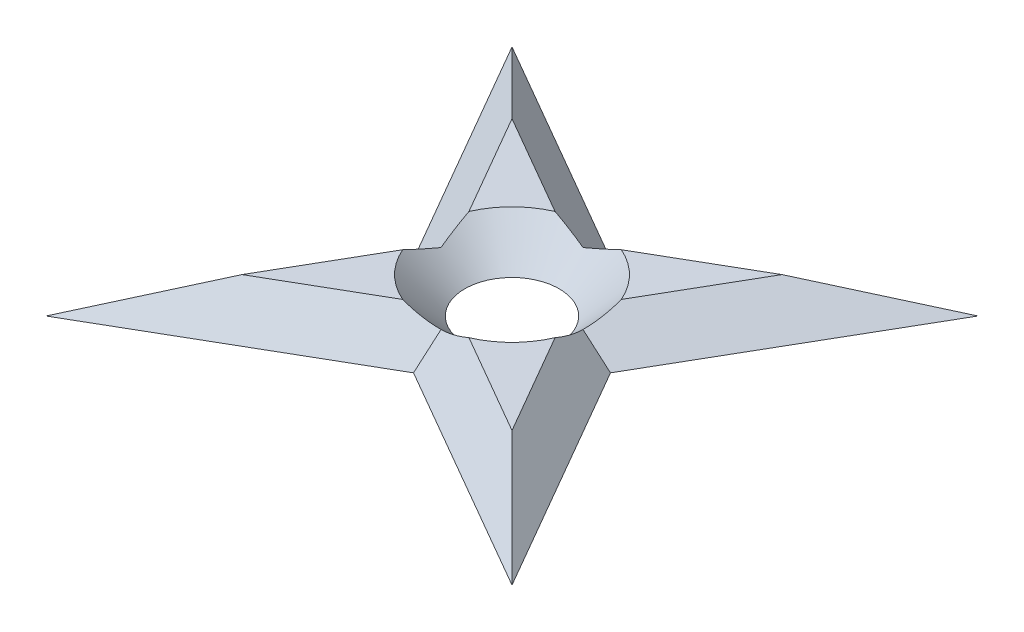
ISO-10303-21;
HEADER;
FILE_DESCRIPTION(('STEP AP214'),'2;1');
FILE_NAME('part.step','',(''),(''),'','','');
FILE_SCHEMA(('AUTOMOTIVE_DESIGN { 1 0 10303 214 1 1 1 1 }'));
ENDSEC;
DATA;
#1=APPLICATION_CONTEXT('core data for automotive mechanical design processes');
#2=APPLICATION_PROTOCOL_DEFINITION('international standard','automotive_design',2000,#1);
#3=PRODUCT_CONTEXT('',#1,'mechanical');
#4=PRODUCT('Part','Part','',(#3));
#5=PRODUCT_RELATED_PRODUCT_CATEGORY('part','',(#4));
#6=PRODUCT_DEFINITION_FORMATION('','',#4);
#7=PRODUCT_DEFINITION_CONTEXT('part definition',#1,'design');
#8=PRODUCT_DEFINITION('design','',#6,#7);
#9=PRODUCT_DEFINITION_SHAPE('','',#8);
#10=(LENGTH_UNIT() NAMED_UNIT(*) SI_UNIT(.MILLI.,.METRE.));
#11=(NAMED_UNIT(*) PLANE_ANGLE_UNIT() SI_UNIT($,.RADIAN.));
#12=(NAMED_UNIT(*) SI_UNIT($,.STERADIAN.) SOLID_ANGLE_UNIT());
#13=UNCERTAINTY_MEASURE_WITH_UNIT(LENGTH_MEASURE(1.E-05),#10,'distance_accuracy_value','');
#14=(GEOMETRIC_REPRESENTATION_CONTEXT(3) GLOBAL_UNCERTAINTY_ASSIGNED_CONTEXT((#13)) GLOBAL_UNIT_ASSIGNED_CONTEXT((#10,
#11,#12)) REPRESENTATION_CONTEXT('',''));
#15=CARTESIAN_POINT('',(0.,0.,0.));
#16=DIRECTION('',(0.,0.,1.));
#17=DIRECTION('',(1.,0.,0.));
#18=AXIS2_PLACEMENT_3D('',#15,#16,#17);
#19=CARTESIAN_POINT('',(0.,10.,0.));
#20=DIRECTION('',(0.,1.,0.));
#21=DIRECTION('',(0.,0.,1.));
#22=AXIS2_PLACEMENT_3D('',#19,#20,#21);
#23=PLANE('',#22);
#24=DIRECTION('',(0.500000000000001,0.,0.866025403784438));
#25=VECTOR('',#24,1.);
#26=CARTESIAN_POINT('',(46.1602540378445,10.,-69.9519052838329));
#27=LINE('',#26,#25);
#28=CARTESIAN_POINT('',(27.3205080756891,10.,-102.583302491977));
#29=VERTEX_POINT('',#28);
#30=CARTESIAN_POINT('',(43.7169200752199,10.,-74.1838838469573));
#31=VERTEX_POINT('',#30);
#32=EDGE_CURVE('E50',#29,#31,#27,.T.);
#33=ORIENTED_EDGE('',*,*,#32,.T.);
#34=CARTESIAN_POINT('',(64.9519052838328,10.,-64.9519052838328));
#35=DIRECTION('',(0.,1.,0.));
#36=DIRECTION('',(0.,0.,1.));
#37=AXIS2_PLACEMENT_3D('',#34,#35,#36);
#38=CIRCLE('',#37,23.155);
#39=CARTESIAN_POINT('',(55.7199267207083,10.,-86.1868904924458));
#40=VERTEX_POINT('',#39);
#41=EDGE_CURVE('E11',#31,#40,#38,.F.);
#42=ORIENTED_EDGE('',*,*,#41,.T.);
#43=DIRECTION('',(-0.866025403784438,0.,-0.500000000000001));
#44=VECTOR('',#43,1.);
#45=CARTESIAN_POINT('',(-5.00000000000002,10.,-121.243556529821));
#46=LINE('',#45,#44);
#47=EDGE_CURVE('E152',#40,#29,#46,.T.);
#48=ORIENTED_EDGE('',*,*,#47,.T.);
#49=EDGE_LOOP('',(#33,#42,#48));
#50=FACE_BOUND('',#49,.T.);
#51=ADVANCED_FACE('F39',(#50),#23,.T.);
#52=DIRECTION('',(-0.866025403784438,0.,0.500000000000001));
#53=VECTOR('',#52,1.);
#54=CARTESIAN_POINT('',(69.9519052838329,10.,-83.7435565298212));
#55=LINE('',#54,#53);
#56=CARTESIAN_POINT('',(102.583302491977,10.,-102.583302491977));
#57=VERTEX_POINT('',#56);
#58=CARTESIAN_POINT('',(74.1838838469573,10.,-86.1868904924458));
#59=VERTEX_POINT('',#58);
#60=EDGE_CURVE('E206',#57,#59,#55,.T.);
#61=ORIENTED_EDGE('',*,*,#60,.T.);
#62=CARTESIAN_POINT('',(64.9519052838328,10.,-64.9519052838328));
#63=DIRECTION('',(0.,1.,0.));
#64=DIRECTION('',(0.,0.,1.));
#65=AXIS2_PLACEMENT_3D('',#62,#63,#64);
#66=CIRCLE('',#65,23.155);
#67=CARTESIAN_POINT('',(86.1868904924459,10.,-74.1838838469573));
#68=VERTEX_POINT('',#67);
#69=EDGE_CURVE('E157',#59,#68,#66,.F.);
#70=ORIENTED_EDGE('',*,*,#69,.T.);
#71=DIRECTION('',(0.5,0.,-0.866025403784438));
#72=VECTOR('',#71,1.);
#73=CARTESIAN_POINT('',(121.243556529821,10.,-134.903810567666));
#74=LINE('',#73,#72);
#75=EDGE_CURVE('E204',#68,#57,#74,.T.);
#76=ORIENTED_EDGE('',*,*,#75,.T.);
#77=EDGE_LOOP('',(#61,#70,#76));
#78=FACE_BOUND('',#77,.T.);
#79=ADVANCED_FACE('F160',(#78),#23,.T.);
#80=DIRECTION('',(-0.500000000000001,0.,-0.866025403784438));
#81=VECTOR('',#80,1.);
#82=CARTESIAN_POINT('',(83.7435565298212,10.,-59.9519052838328));
#83=LINE('',#82,#81);
#84=CARTESIAN_POINT('',(102.583302491977,10.,-27.320508075689));
#85=VERTEX_POINT('',#84);
#86=CARTESIAN_POINT('',(86.1868904924458,10.,-55.7199267207084));
#87=VERTEX_POINT('',#86);
#88=EDGE_CURVE('E196',#85,#87,#83,.T.);
#89=ORIENTED_EDGE('',*,*,#88,.T.);
#90=CARTESIAN_POINT('',(64.9519052838328,10.,-64.9519052838328));
#91=DIRECTION('',(0.,1.,0.));
#92=DIRECTION('',(0.,0.,1.));
#93=AXIS2_PLACEMENT_3D('',#90,#91,#92);
#94=CIRCLE('',#93,23.155);
#95=CARTESIAN_POINT('',(74.1838838469573,10.,-43.7169200752199));
#96=VERTEX_POINT('',#95);
#97=EDGE_CURVE('E201',#87,#96,#94,.F.);
#98=ORIENTED_EDGE('',*,*,#97,.T.);
#99=DIRECTION('',(0.866025403784438,0.,0.500000000000001));
#100=VECTOR('',#99,1.);
#101=CARTESIAN_POINT('',(134.903810567666,10.,-8.66025403784442));
#102=LINE('',#101,#100);
#103=EDGE_CURVE('E194',#96,#85,#102,.T.);
#104=ORIENTED_EDGE('',*,*,#103,.T.);
#105=EDGE_LOOP('',(#89,#98,#104));
#106=FACE_BOUND('',#105,.T.);
#107=ADVANCED_FACE('F166',(#106),#23,.T.);
#108=DIRECTION('',(0.866025403784438,0.,-0.500000000000001));
#109=VECTOR('',#108,1.);
#110=CARTESIAN_POINT('',(59.9519052838328,10.,-46.1602540378445));
#111=LINE('',#110,#109);
#112=CARTESIAN_POINT('',(27.320508075689,10.,-27.320508075689));
#113=VERTEX_POINT('',#112);
#114=CARTESIAN_POINT('',(55.7199267207084,10.,-43.7169200752199));
#115=VERTEX_POINT('',#114);
#116=EDGE_CURVE('E180',#113,#115,#111,.T.);
#117=ORIENTED_EDGE('',*,*,#116,.T.);
#118=CARTESIAN_POINT('',(64.9519052838328,10.,-64.9519052838328));
#119=DIRECTION('',(0.,1.,0.));
#120=DIRECTION('',(0.,0.,1.));
#121=AXIS2_PLACEMENT_3D('',#118,#119,#120);
#122=CIRCLE('',#121,23.155);
#123=CARTESIAN_POINT('',(43.7169200752199,10.,-55.7199267207084));
#124=VERTEX_POINT('',#123);
#125=EDGE_CURVE('E182',#115,#124,#122,.F.);
#126=ORIENTED_EDGE('',*,*,#125,.T.);
#127=DIRECTION('',(-0.500000000000001,0.,0.866025403784438));
#128=VECTOR('',#127,1.);
#129=CARTESIAN_POINT('',(8.66025403784443,10.,5.00000000000004));
#130=LINE('',#129,#128);
#131=EDGE_CURVE('E184',#124,#113,#130,.T.);
#132=ORIENTED_EDGE('',*,*,#131,.T.);
#133=EDGE_LOOP('',(#117,#126,#132));
#134=FACE_BOUND('',#133,.T.);
#135=ADVANCED_FACE('F162',(#134),#23,.T.);
#136=CARTESIAN_POINT('',(0.,0.,0.));
#137=DIRECTION('',(0.,1.,0.));
#138=DIRECTION('',(0.,0.,1.));
#139=AXIS2_PLACEMENT_3D('',#136,#137,#138);
#140=PLANE('',#139);
#141=DIRECTION('',(0.866025403784438,0.,-0.500000000000001));
#142=VECTOR('',#141,1.);
#143=CARTESIAN_POINT('',(0.,0.,0.));
#144=LINE('',#143,#142);
#145=CARTESIAN_POINT('',(0.,0.,0.));
#146=VERTEX_POINT('',#145);
#147=CARTESIAN_POINT('',(64.9519052838328,0.,-37.5000000000001));
#148=VERTEX_POINT('',#147);
#149=EDGE_CURVE('E342',#146,#148,#144,.T.);
#150=ORIENTED_EDGE('',*,*,#149,.F.);
#151=DIRECTION('',(-0.500000000000001,0.,0.866025403784438));
#152=VECTOR('',#151,1.);
#153=CARTESIAN_POINT('',(0.,0.,0.));
#154=LINE('',#153,#152);
#155=CARTESIAN_POINT('',(37.5000000000001,0.,-64.9519052838328));
#156=VERTEX_POINT('',#155);
#157=EDGE_CURVE('E187',#156,#146,#154,.T.);
#158=ORIENTED_EDGE('',*,*,#157,.F.);
#159=DIRECTION('',(0.500000000000001,0.,0.866025403784438));
#160=VECTOR('',#159,1.);
#161=CARTESIAN_POINT('',(0.,0.,-129.903810567666));
#162=LINE('',#161,#160);
#163=CARTESIAN_POINT('',(0.,0.,-129.903810567666));
#164=VERTEX_POINT('',#163);
#165=EDGE_CURVE('E361',#164,#156,#162,.T.);
#166=ORIENTED_EDGE('',*,*,#165,.F.);
#167=DIRECTION('',(-0.866025403784438,0.,-0.500000000000001));
#168=VECTOR('',#167,1.);
#169=CARTESIAN_POINT('',(0.,0.,-129.903810567666));
#170=LINE('',#169,#168);
#171=CARTESIAN_POINT('',(64.9519052838328,0.,-92.4038105676656));
#172=VERTEX_POINT('',#171);
#173=EDGE_CURVE('E359',#172,#164,#170,.T.);
#174=ORIENTED_EDGE('',*,*,#173,.F.);
#175=DIRECTION('',(-0.866025403784438,0.,0.500000000000001));
#176=VECTOR('',#175,1.);
#177=CARTESIAN_POINT('',(129.903810567666,0.,-129.903810567666));
#178=LINE('',#177,#176);
#179=CARTESIAN_POINT('',(129.903810567666,0.,-129.903810567666));
#180=VERTEX_POINT('',#179);
#181=EDGE_CURVE('E356',#180,#172,#178,.T.);
#182=ORIENTED_EDGE('',*,*,#181,.F.);
#183=DIRECTION('',(0.5,0.,-0.866025403784438));
#184=VECTOR('',#183,1.);
#185=CARTESIAN_POINT('',(129.903810567666,0.,-129.903810567666));
#186=LINE('',#185,#184);
#187=CARTESIAN_POINT('',(92.4038105676656,0.,-64.9519052838328));
#188=VERTEX_POINT('',#187);
#189=EDGE_CURVE('E353',#188,#180,#186,.T.);
#190=ORIENTED_EDGE('',*,*,#189,.F.);
#191=DIRECTION('',(-0.500000000000001,0.,-0.866025403784438));
#192=VECTOR('',#191,1.);
#193=CARTESIAN_POINT('',(129.903810567666,0.,0.));
#194=LINE('',#193,#192);
#195=CARTESIAN_POINT('',(129.903810567666,0.,0.));
#196=VERTEX_POINT('',#195);
#197=EDGE_CURVE('E346',#196,#188,#194,.T.);
#198=ORIENTED_EDGE('',*,*,#197,.F.);
#199=DIRECTION('',(0.866025403784438,0.,0.500000000000001));
#200=VECTOR('',#199,1.);
#201=CARTESIAN_POINT('',(129.903810567666,0.,0.));
#202=LINE('',#201,#200);
#203=EDGE_CURVE('E89',#148,#196,#202,.T.);
#204=ORIENTED_EDGE('',*,*,#203,.F.);
#205=EDGE_LOOP('',(#150,#158,#166,#174,#182,#190,#198,#204));
#206=FACE_BOUND('',#205,.T.);
#207=CARTESIAN_POINT('',(64.9519052838328,0.,-64.9519052838328));
#208=DIRECTION('',(0.,1.,0.));
#209=DIRECTION('',(0.,0.,1.));
#210=AXIS2_PLACEMENT_3D('',#207,#208,#209);
#211=CIRCLE('',#210,13.155);
#212=CARTESIAN_POINT('',(64.9519052838328,0.,-51.7969052838328));
#213=VERTEX_POINT('',#212);
#214=EDGE_CURVE('E340',#213,#213,#211,.T.);
#215=ORIENTED_EDGE('',*,*,#214,.T.);
#216=EDGE_LOOP('',(#215));
#217=FACE_BOUND('',#216,.T.);
#218=ADVANCED_FACE('F170',(#206,#217),#140,.F.);
#219=CARTESIAN_POINT('',(37.4759526419166,10.,-64.9102540378445));
#220=DIRECTION('',(-0.353553390593276,0.707106781186545,0.612372435695796));
#221=DIRECTION('',(-0.866025403784438,0.,-0.500000000000001));
#222=AXIS2_PLACEMENT_3D('',#219,#220,#221);
#223=PLANE('',#222);
#224=DIRECTION('',(0.,0.654653670707979,-0.755928946018453));
#225=VECTOR('',#224,1.);
#226=CARTESIAN_POINT('',(64.9519052838328,17.8502721834047,-58.1117189003937));
#227=LINE('',#226,#225);
#228=CARTESIAN_POINT('',(64.9519052838328,6.63521683369823,-45.1616884501346));
#229=VERTEX_POINT('',#228);
#230=EDGE_CURVE('E44',#148,#229,#227,.T.);
#231=ORIENTED_EDGE('',*,*,#230,.F.);
#232=ORIENTED_EDGE('',*,*,#203,.T.);
#233=DIRECTION('',(-0.684550319445298,0.250562807085732,-0.684550319445298));
#234=VECTOR('',#233,1.);
#235=CARTESIAN_POINT('',(54.4585047580482,27.6148985226056,-75.4453058096175));
#236=LINE('',#235,#234);
#237=EDGE_CURVE('E378',#85,#196,#236,.F.);
#238=ORIENTED_EDGE('',*,*,#237,.F.);
#239=ORIENTED_EDGE('',*,*,#103,.F.);
#240=CARTESIAN_POINT('',(64.9517052838328,6.63516324432876,-45.1617420405147));
#241=CARTESIAN_POINT('',(65.7300567255331,6.84370314604465,-44.9531617629098));
#242=CARTESIAN_POINT('',(66.5087217713623,7.07366781607212,-44.7691396173806));
#243=CARTESIAN_POINT('',(68.0602000208628,7.57049424756725,-44.4470789803181));
#244=CARTESIAN_POINT('',(68.8330241250717,7.83720067346883,-44.3088548292946));
#245=CARTESIAN_POINT('',(70.3721143174705,8.4031048622828,-44.0737105639007));
#246=CARTESIAN_POINT('',(71.1383855348935,8.70227410078863,-43.9767545510184));
#247=CARTESIAN_POINT('',(72.2833836414132,9.17287545074651,-43.859093218156));
#248=CARTESIAN_POINT('',(72.6651191285899,9.33374807439782,-43.824457837016));
#249=CARTESIAN_POINT('',(73.4263925525419,9.66211973841133,-43.7641073579953));
#250=CARTESIAN_POINT('',(73.8059307247176,9.82961805331362,-43.7383912865172));
#251=CARTESIAN_POINT('',(74.1843274971395,10.0002,-43.7168948737755));
#252=B_SPLINE_CURVE_WITH_KNOTS('',3,(#240,#241,#242,#243,#244,#245,#246,#247,#248,#249,#250,
#251),.UNSPECIFIED.,.F.,.F.,(4,2,2,2,2,4),(0.,2.49572217408774,4.9811995460125,7.46451039908723,
8.71146206701965,9.95827757965139),.UNSPECIFIED.);
#253=EDGE_CURVE('E191',#229,#96,#252,.T.);
#254=ORIENTED_EDGE('',*,*,#253,.F.);
#255=EDGE_LOOP('',(#231,#232,#238,#239,#254));
#256=FACE_BOUND('',#255,.T.);
#257=ADVANCED_FACE('F176',(#256),#223,.T.);
#258=CARTESIAN_POINT('',(-5.00000000000004,10.,-8.66025403784442));
#259=DIRECTION('',(0.353553390593275,0.707106781186546,0.612372435695795));
#260=DIRECTION('',(-0.866025403784438,0.,0.500000000000001));
#261=AXIS2_PLACEMENT_3D('',#258,#259,#260);
#262=PLANE('',#261);
#263=CARTESIAN_POINT('',(55.7194830705263,10.0002,-43.7168948737755));
#264=CARTESIAN_POINT('',(56.0978798429482,9.8296180533136,-43.7383912865172));
#265=CARTESIAN_POINT('',(56.4774180151239,9.6621197384113,-43.7641073579953));
#266=CARTESIAN_POINT('',(57.2386914390758,9.3337480743978,-43.824457837016));
#267=CARTESIAN_POINT('',(57.6204269262525,9.1728754507465,-43.859093218156));
#268=CARTESIAN_POINT('',(58.7654250327722,8.70227410078862,-43.9767545510184));
#269=CARTESIAN_POINT('',(59.5316962501952,8.40310486228279,-44.0737105639007));
#270=CARTESIAN_POINT('',(61.0707864425939,7.83720067346883,-44.3088548292946));
#271=CARTESIAN_POINT('',(61.8436105468029,7.57049424756724,-44.4470789803181));
#272=CARTESIAN_POINT('',(63.3950887963034,7.07366781607211,-44.7691396173806));
#273=CARTESIAN_POINT('',(64.1737538421326,6.84370314604465,-44.9531617629098));
#274=CARTESIAN_POINT('',(64.9521052838329,6.63516324432877,-45.1617420405147));
#275=B_SPLINE_CURVE_WITH_KNOTS('',3,(#263,#264,#265,#266,#267,#268,#269,#270,#271,#272,#273,
#274),.UNSPECIFIED.,.F.,.F.,(4,2,2,2,2,4),(0.,1.24681551263172,2.49376718056415,
4.97707803363885,7.46255540556362,9.95827757965133),.UNSPECIFIED.);
#276=EDGE_CURVE('E189',#115,#229,#275,.T.);
#277=ORIENTED_EDGE('',*,*,#276,.F.);
#278=ORIENTED_EDGE('',*,*,#116,.F.);
#279=DIRECTION('',(-0.684550319445298,-0.250562807085731,0.684550319445298));
#280=VECTOR('',#279,1.);
#281=CARTESIAN_POINT('',(3.43045699263297,1.25563440589354,-3.43045699263297));
#282=LINE('',#281,#280);
#283=EDGE_CURVE('E341',#146,#113,#282,.F.);
#284=ORIENTED_EDGE('',*,*,#283,.F.);
#285=ORIENTED_EDGE('',*,*,#149,.T.);
#286=ORIENTED_EDGE('',*,*,#230,.T.);
#287=EDGE_LOOP('',(#277,#278,#284,#285,#286));
#288=FACE_BOUND('',#287,.T.);
#289=ADVANCED_FACE('F190',(#288),#262,.T.);
#290=CARTESIAN_POINT('',(8.66025403784443,10.,5.00000000000004));
#291=DIRECTION('',(-0.612372435695795,0.707106781186546,-0.353553390593275));
#292=DIRECTION('',(0.500000000000001,0.,-0.866025403784438));
#293=AXIS2_PLACEMENT_3D('',#290,#291,#292);
#294=PLANE('',#293);
#295=DIRECTION('',(0.755928946018454,0.654653670707978,0.));
#296=VECTOR('',#295,1.);
#297=CARTESIAN_POINT('',(25.9688617575366,-9.98625865252373,-64.9519052838328));
#298=LINE('',#297,#296);
#299=CARTESIAN_POINT('',(45.1616884501346,6.63521683369824,-64.9519052838328));
#300=VERTEX_POINT('',#299);
#301=EDGE_CURVE('E73',#156,#300,#298,.T.);
#302=ORIENTED_EDGE('',*,*,#301,.F.);
#303=ORIENTED_EDGE('',*,*,#157,.T.);
#304=ORIENTED_EDGE('',*,*,#283,.T.);
#305=ORIENTED_EDGE('',*,*,#131,.F.);
#306=CARTESIAN_POINT('',(45.1617420405147,6.63516324432878,-64.9521052838329));
#307=CARTESIAN_POINT('',(44.9531617629098,6.84370314604466,-64.1737538421326));
#308=CARTESIAN_POINT('',(44.7691396173806,7.07366781607212,-63.3950887963033));
#309=CARTESIAN_POINT('',(44.4470789803181,7.57049424756725,-61.8436105468029));
#310=CARTESIAN_POINT('',(44.3088548292946,7.83720067346884,-61.0707864425939));
#311=CARTESIAN_POINT('',(44.0737105639007,8.40310486228281,-59.5316962501952));
#312=CARTESIAN_POINT('',(43.9767545510184,8.70227410078863,-58.7654250327722));
#313=CARTESIAN_POINT('',(43.859093218156,9.1728754507465,-57.6204269262525));
#314=CARTESIAN_POINT('',(43.824457837016,9.33374807439781,-57.2386914390758));
#315=CARTESIAN_POINT('',(43.7641073579953,9.66211973841132,-56.4774180151238));
#316=CARTESIAN_POINT('',(43.7383912865172,9.82961805331362,-56.0978798429482));
#317=CARTESIAN_POINT('',(43.7168948737755,10.0002,-55.7194830705262));
#318=B_SPLINE_CURVE_WITH_KNOTS('',3,(#306,#307,#308,#309,#310,#311,#312,#313,#314,#315,#316,
#317),.UNSPECIFIED.,.F.,.F.,(4,2,2,2,2,4),(0.,2.49572217408772,4.98119954601248,7.4645103990872,
8.71146206701962,9.95827757965134),.UNSPECIFIED.);
#319=EDGE_CURVE('E192',#300,#124,#318,.T.);
#320=ORIENTED_EDGE('',*,*,#319,.F.);
#321=EDGE_LOOP('',(#302,#303,#304,#305,#320));
#322=FACE_BOUND('',#321,.T.);
#323=ADVANCED_FACE('F294',(#322),#294,.T.);
#324=CARTESIAN_POINT('',(64.9102540378445,10.,-37.4759526419166));
#325=DIRECTION('',(-0.612372435695795,0.707106781186546,0.353553390593275));
#326=DIRECTION('',(-0.500000000000001,0.,-0.866025403784438));
#327=AXIS2_PLACEMENT_3D('',#324,#325,#326);
#328=PLANE('',#327);
#329=CARTESIAN_POINT('',(43.7168948737755,10.0002,-74.1843274971394));
#330=CARTESIAN_POINT('',(43.7383912865172,9.82961805331361,-73.8059307247175));
#331=CARTESIAN_POINT('',(43.7641073579953,9.66211973841131,-73.4263925525419));
#332=CARTESIAN_POINT('',(43.824457837016,9.33374807439781,-72.6651191285899));
#333=CARTESIAN_POINT('',(43.859093218156,9.17287545074651,-72.2833836414132));
#334=CARTESIAN_POINT('',(43.9767545510184,8.70227410078863,-71.1383855348935));
#335=CARTESIAN_POINT('',(44.0737105639007,8.40310486228281,-70.3721143174705));
#336=CARTESIAN_POINT('',(44.3088548292946,7.83720067346884,-68.8330241250717));
#337=CARTESIAN_POINT('',(44.4470789803181,7.57049424756725,-68.0602000208628));
#338=CARTESIAN_POINT('',(44.7691396173806,7.07366781607212,-66.5087217713623));
#339=CARTESIAN_POINT('',(44.9531617629098,6.84370314604466,-65.7300567255331));
#340=CARTESIAN_POINT('',(45.1617420405147,6.63516324432878,-64.9517052838329));
#341=B_SPLINE_CURVE_WITH_KNOTS('',3,(#329,#330,#331,#332,#333,#334,#335,#336,#337,#338,#339,
#340),.UNSPECIFIED.,.F.,.F.,(4,2,2,2,2,4),(0.,1.24681551263172,2.49376718056413,
4.97707803363884,7.46255540556361,9.95827757965132),.UNSPECIFIED.);
#342=EDGE_CURVE('E149',#31,#300,#341,.T.);
#343=ORIENTED_EDGE('',*,*,#342,.F.);
#344=ORIENTED_EDGE('',*,*,#32,.F.);
#345=DIRECTION('',(0.684550319445297,0.250562807085731,0.684550319445298));
#346=VECTOR('',#345,1.);
#347=CARTESIAN_POINT('',(45.0082493427693,16.4741626393177,-84.8955612248964));
#348=LINE('',#347,#346);
#349=EDGE_CURVE('E156',#164,#29,#348,.T.);
#350=ORIENTED_EDGE('',*,*,#349,.F.);
#351=ORIENTED_EDGE('',*,*,#165,.T.);
#352=ORIENTED_EDGE('',*,*,#301,.T.);
#353=EDGE_LOOP('',(#343,#344,#350,#351,#352));
#354=FACE_BOUND('',#353,.T.);
#355=ADVANCED_FACE('F283',(#354),#328,.T.);
#356=CARTESIAN_POINT('',(51.25,10.,-88.7676038879047));
#357=DIRECTION('',(0.353553390593275,0.707106781186547,-0.612372435695795));
#358=DIRECTION('',(0.866025403784438,0.,0.500000000000001));
#359=AXIS2_PLACEMENT_3D('',#356,#357,#358);
#360=PLANE('',#359);
#361=DIRECTION('',(0.,0.654653670707978,0.755928946018454));
#362=VECTOR('',#361,1.);
#363=CARTESIAN_POINT('',(64.9519052838328,6.0851699189049,-85.3772615861768));
#364=LINE('',#363,#362);
#365=CARTESIAN_POINT('',(64.9519052838328,6.63521683369823,-84.7421221175311));
#366=VERTEX_POINT('',#365);
#367=EDGE_CURVE('E365',#172,#366,#364,.T.);
#368=ORIENTED_EDGE('',*,*,#367,.F.);
#369=ORIENTED_EDGE('',*,*,#173,.T.);
#370=ORIENTED_EDGE('',*,*,#349,.T.);
#371=ORIENTED_EDGE('',*,*,#47,.F.);
#372=CARTESIAN_POINT('',(64.9521052838328,6.63516324432876,-84.742068527151));
#373=CARTESIAN_POINT('',(64.1737538421326,6.84370314604465,-84.9506488047559));
#374=CARTESIAN_POINT('',(63.3950887963033,7.07366781607211,-85.1346709502851));
#375=CARTESIAN_POINT('',(61.8436105468028,7.57049424756724,-85.4567315873476));
#376=CARTESIAN_POINT('',(61.0707864425939,7.83720067346883,-85.594955738371));
#377=CARTESIAN_POINT('',(59.5316962501952,8.40310486228279,-85.830100003765));
#378=CARTESIAN_POINT('',(58.7654250327721,8.70227410078862,-85.9270560166473));
#379=CARTESIAN_POINT('',(57.6204269262525,9.1728754507465,-86.0447173495097));
#380=CARTESIAN_POINT('',(57.2386914390758,9.33374807439781,-86.0793527306497));
#381=CARTESIAN_POINT('',(56.4774180151238,9.66211973841131,-86.1397032096704));
#382=CARTESIAN_POINT('',(56.0978798429481,9.82961805331361,-86.1654192811485));
#383=CARTESIAN_POINT('',(55.7194830705262,10.0002,-86.1869156938902));
#384=B_SPLINE_CURVE_WITH_KNOTS('',3,(#372,#373,#374,#375,#376,#377,#378,#379,#380,#381,#382,
#383),.UNSPECIFIED.,.F.,.F.,(4,2,2,2,2,4),(0.,2.49572217408772,4.98119954601248,7.4645103990872,
8.71146206701963,9.95827757965134),.UNSPECIFIED.);
#385=EDGE_CURVE('E139',#366,#40,#384,.T.);
#386=ORIENTED_EDGE('',*,*,#385,.F.);
#387=EDGE_LOOP('',(#368,#369,#370,#371,#386));
#388=FACE_BOUND('',#387,.T.);
#389=ADVANCED_FACE('F153',(#388),#360,.T.);
#390=CARTESIAN_POINT('',(-18.7740473580834,10.,-32.5176038879046));
#391=DIRECTION('',(-0.353553390593275,0.707106781186547,-0.612372435695795));
#392=DIRECTION('',(0.866025403784438,0.,-0.500000000000001));
#393=AXIS2_PLACEMENT_3D('',#390,#391,#392);
#394=PLANE('',#393);
#395=CARTESIAN_POINT('',(74.1843274971395,10.0002,-86.1869156938902));
#396=CARTESIAN_POINT('',(73.8059307247176,9.82961805331362,-86.1654192811485));
#397=CARTESIAN_POINT('',(73.4263925525419,9.66211973841132,-86.1397032096704));
#398=CARTESIAN_POINT('',(72.6651191285899,9.33374807439781,-86.0793527306497));
#399=CARTESIAN_POINT('',(72.2833836414132,9.1728754507465,-86.0447173495097));
#400=CARTESIAN_POINT('',(71.1383855348935,8.70227410078863,-85.9270560166473));
#401=CARTESIAN_POINT('',(70.3721143174705,8.4031048622828,-85.830100003765));
#402=CARTESIAN_POINT('',(68.8330241250717,7.83720067346884,-85.5949557383711));
#403=CARTESIAN_POINT('',(68.0602000208628,7.57049424756724,-85.4567315873476));
#404=CARTESIAN_POINT('',(66.5087217713623,7.07366781607211,-85.1346709502851));
#405=CARTESIAN_POINT('',(65.7300567255331,6.84370314604465,-84.9506488047559));
#406=CARTESIAN_POINT('',(64.9517052838328,6.63516324432877,-84.742068527151));
#407=B_SPLINE_CURVE_WITH_KNOTS('',3,(#395,#396,#397,#398,#399,#400,#401,#402,#403,#404,#405,
#406),.UNSPECIFIED.,.F.,.F.,(4,2,2,2,2,4),(0.,1.24681551263172,2.49376718056416,
4.97707803363888,7.46255540556363,9.95827757965137),.UNSPECIFIED.);
#408=EDGE_CURVE('E146',#59,#366,#407,.T.);
#409=ORIENTED_EDGE('',*,*,#408,.F.);
#410=ORIENTED_EDGE('',*,*,#60,.F.);
#411=DIRECTION('',(-0.684550319445297,0.250562807085732,0.684550319445298));
#412=VECTOR('',#411,1.);
#413=CARTESIAN_POINT('',(12.880712407912,42.8334267560298,-12.8807124079118));
#414=LINE('',#413,#412);
#415=EDGE_CURVE('E368',#180,#57,#414,.T.);
#416=ORIENTED_EDGE('',*,*,#415,.F.);
#417=ORIENTED_EDGE('',*,*,#181,.T.);
#418=ORIENTED_EDGE('',*,*,#367,.T.);
#419=EDGE_LOOP('',(#409,#410,#416,#417,#418));
#420=FACE_BOUND('',#419,.T.);
#421=ADVANCED_FACE('F249',(#420),#394,.T.);
#422=CARTESIAN_POINT('',(32.5176038879048,10.,18.7740473580835));
#423=DIRECTION('',(0.612372435695796,0.707106781186545,0.353553390593275));
#424=DIRECTION('',(-0.5,0.,0.866025403784438));
#425=AXIS2_PLACEMENT_3D('',#422,#423,#424);
#426=PLANE('',#425);
#427=DIRECTION('',(-0.755928946018453,0.654653670707979,0.));
#428=VECTOR('',#427,1.);
#429=CARTESIAN_POINT('',(53.2344044433197,33.9217007548334,-64.9519052838327));
#430=LINE('',#429,#428);
#431=CARTESIAN_POINT('',(84.7421221175311,6.63521683369825,-64.9519052838328));
#432=VERTEX_POINT('',#431);
#433=EDGE_CURVE('E375',#188,#432,#430,.T.);
#434=ORIENTED_EDGE('',*,*,#433,.F.);
#435=ORIENTED_EDGE('',*,*,#189,.T.);
#436=ORIENTED_EDGE('',*,*,#415,.T.);
#437=ORIENTED_EDGE('',*,*,#75,.F.);
#438=CARTESIAN_POINT('',(84.742068527151,6.63516324432877,-64.9517052838328));
#439=CARTESIAN_POINT('',(84.9506488047559,6.84370314604466,-65.730056725533));
#440=CARTESIAN_POINT('',(85.1346709502851,7.07366781607212,-66.5087217713623));
#441=CARTESIAN_POINT('',(85.4567315873476,7.57049424756724,-68.0602000208628));
#442=CARTESIAN_POINT('',(85.5949557383711,7.83720067346883,-68.8330241250717));
#443=CARTESIAN_POINT('',(85.830100003765,8.4031048622828,-70.3721143174704));
#444=CARTESIAN_POINT('',(85.9270560166473,8.70227410078862,-71.1383855348935));
#445=CARTESIAN_POINT('',(86.0447173495097,9.1728754507465,-72.2833836414131));
#446=CARTESIAN_POINT('',(86.0793527306497,9.33374807439781,-72.6651191285898));
#447=CARTESIAN_POINT('',(86.1397032096704,9.66211973841131,-73.4263925525418));
#448=CARTESIAN_POINT('',(86.1654192811485,9.82961805331361,-73.8059307247175));
#449=CARTESIAN_POINT('',(86.1869156938902,10.0002,-74.1843274971394));
#450=B_SPLINE_CURVE_WITH_KNOTS('',3,(#438,#439,#440,#441,#442,#443,#444,#445,#446,#447,#448,
#449),.UNSPECIFIED.,.F.,.F.,(4,2,2,2,2,4),(0.,2.49572217408772,4.98119954601248,
7.46451039908719,8.71146206701963,9.95827757965136),.UNSPECIFIED.);
#451=EDGE_CURVE('E220',#432,#68,#450,.T.);
#452=ORIENTED_EDGE('',*,*,#451,.F.);
#453=EDGE_LOOP('',(#434,#435,#436,#437,#452));
#454=FACE_BOUND('',#453,.T.);
#455=ADVANCED_FACE('F237',(#454),#426,.T.);
#456=CARTESIAN_POINT('',(88.7676038879047,10.,-51.25));
#457=DIRECTION('',(0.612372435695795,0.707106781186546,-0.353553390593275));
#458=DIRECTION('',(0.500000000000001,0.,0.866025403784438));
#459=AXIS2_PLACEMENT_3D('',#456,#457,#458);
#460=PLANE('',#459);
#461=ORIENTED_EDGE('',*,*,#197,.T.);
#462=ORIENTED_EDGE('',*,*,#433,.T.);
#463=CARTESIAN_POINT('',(86.1869156938902,10.0002,-55.7194830705262));
#464=CARTESIAN_POINT('',(86.1654192811485,9.82961805331362,-56.0978798429482));
#465=CARTESIAN_POINT('',(86.1397032096704,9.66211973841132,-56.4774180151238));
#466=CARTESIAN_POINT('',(86.0793527306497,9.33374807439782,-57.2386914390758));
#467=CARTESIAN_POINT('',(86.0447173495097,9.17287545074651,-57.6204269262525));
#468=CARTESIAN_POINT('',(85.9270560166473,8.70227410078863,-58.7654250327722));
#469=CARTESIAN_POINT('',(85.830100003765,8.40310486228281,-59.5316962501952));
#470=CARTESIAN_POINT('',(85.5949557383711,7.83720067346884,-61.0707864425939));
#471=CARTESIAN_POINT('',(85.4567315873476,7.57049424756725,-61.8436105468029));
#472=CARTESIAN_POINT('',(85.1346709502851,7.07366781607212,-63.3950887963033));
#473=CARTESIAN_POINT('',(84.9506488047559,6.84370314604466,-64.1737538421326));
#474=CARTESIAN_POINT('',(84.742068527151,6.63516324432878,-64.9521052838329));
#475=B_SPLINE_CURVE_WITH_KNOTS('',3,(#463,#464,#465,#466,#467,#468,#469,#470,#471,#472,#473,
#474),.UNSPECIFIED.,.F.,.F.,(4,2,2,2,2,4),(0.,1.24681551263172,2.49376718056414,
4.97707803363885,7.46255540556361,9.95827757965133),.UNSPECIFIED.);
#476=EDGE_CURVE('E211',#87,#432,#475,.T.);
#477=ORIENTED_EDGE('',*,*,#476,.F.);
#478=ORIENTED_EDGE('',*,*,#88,.F.);
#479=ORIENTED_EDGE('',*,*,#237,.T.);
#480=EDGE_LOOP('',(#461,#462,#477,#478,#479));
#481=FACE_BOUND('',#480,.T.);
#482=ADVANCED_FACE('F231',(#481),#460,.T.);
#483=CARTESIAN_POINT('',(64.9519052838328,0.,-64.9519052838328));
#484=DIRECTION('',(0.,1.,0.));
#485=DIRECTION('',(0.,0.,1.));
#486=AXIS2_PLACEMENT_3D('',#483,#484,#485);
#487=CONICAL_SURFACE('',#486,13.155,0.78539816339745);
#488=ORIENTED_EDGE('',*,*,#276,.T.);
#489=ORIENTED_EDGE('',*,*,#253,.T.);
#490=ORIENTED_EDGE('',*,*,#97,.F.);
#491=ORIENTED_EDGE('',*,*,#476,.T.);
#492=ORIENTED_EDGE('',*,*,#451,.T.);
#493=ORIENTED_EDGE('',*,*,#69,.F.);
#494=ORIENTED_EDGE('',*,*,#408,.T.);
#495=ORIENTED_EDGE('',*,*,#385,.T.);
#496=ORIENTED_EDGE('',*,*,#41,.F.);
#497=ORIENTED_EDGE('',*,*,#342,.T.);
#498=ORIENTED_EDGE('',*,*,#319,.T.);
#499=ORIENTED_EDGE('',*,*,#125,.F.);
#500=EDGE_LOOP('',(#488,#489,#490,#491,#492,#493,#494,#495,#496,#497,#498,#499));
#501=FACE_BOUND('',#500,.T.);
#502=ORIENTED_EDGE('',*,*,#214,.F.);
#503=EDGE_LOOP('',(#502));
#504=FACE_BOUND('',#503,.T.);
#505=ADVANCED_FACE('F42',(#501,#504),#487,.F.);
#506=CLOSED_SHELL('',(#51,#79,#107,#135,#218,#257,#289,#323,#355,#389,#421,#455,#482,#505));
#507=MANIFOLD_SOLID_BREP('B2',#506);
#508=ADVANCED_BREP_SHAPE_REPRESENTATION('',(#18,#507),#14);
#509=SHAPE_DEFINITION_REPRESENTATION(#9,#508);
ENDSEC;
END-ISO-10303-21;
